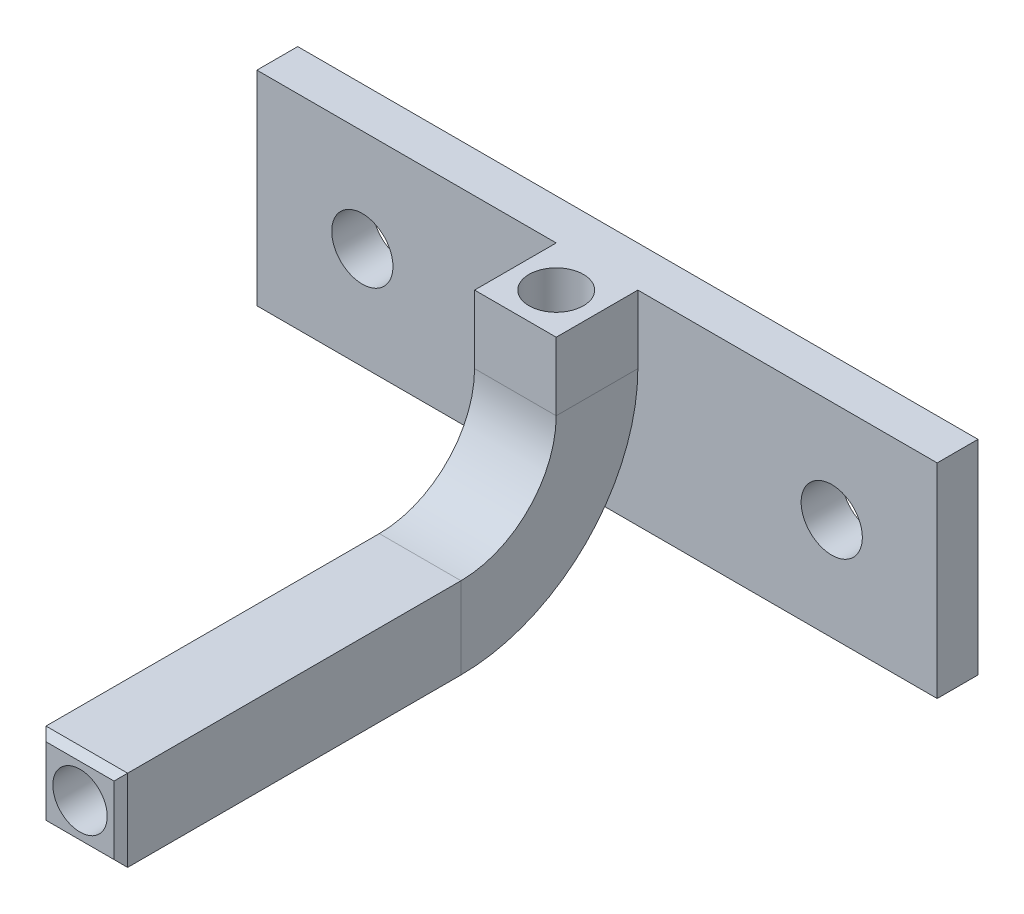
ISO-10303-21;
HEADER;
FILE_DESCRIPTION(('STEP AP214'),'2;1');
FILE_NAME('part.step','',(''),(''),'','','');
FILE_SCHEMA(('AUTOMOTIVE_DESIGN { 1 0 10303 214 1 1 1 1 }'));
ENDSEC;
DATA;
#1=APPLICATION_CONTEXT('core data for automotive mechanical design processes');
#2=APPLICATION_PROTOCOL_DEFINITION('international standard','automotive_design',2000,#1);
#3=PRODUCT_CONTEXT('',#1,'mechanical');
#4=PRODUCT('Part','Part','',(#3));
#5=PRODUCT_RELATED_PRODUCT_CATEGORY('part','',(#4));
#6=PRODUCT_DEFINITION_FORMATION('','',#4);
#7=PRODUCT_DEFINITION_CONTEXT('part definition',#1,'design');
#8=PRODUCT_DEFINITION('design','',#6,#7);
#9=PRODUCT_DEFINITION_SHAPE('','',#8);
#10=(LENGTH_UNIT() NAMED_UNIT(*) SI_UNIT(.MILLI.,.METRE.));
#11=(NAMED_UNIT(*) PLANE_ANGLE_UNIT() SI_UNIT($,.RADIAN.));
#12=(NAMED_UNIT(*) SI_UNIT($,.STERADIAN.) SOLID_ANGLE_UNIT());
#13=UNCERTAINTY_MEASURE_WITH_UNIT(LENGTH_MEASURE(1.E-05),#10,'distance_accuracy_value','');
#14=(GEOMETRIC_REPRESENTATION_CONTEXT(3) GLOBAL_UNCERTAINTY_ASSIGNED_CONTEXT((#13)) GLOBAL_UNIT_ASSIGNED_CONTEXT((#10,
#11,#12)) REPRESENTATION_CONTEXT('',''));
#15=CARTESIAN_POINT('',(0.,0.,0.));
#16=DIRECTION('',(0.,0.,1.));
#17=DIRECTION('',(1.,0.,0.));
#18=AXIS2_PLACEMENT_3D('',#15,#16,#17);
#19=CARTESIAN_POINT('',(0.,0.,3.));
#20=DIRECTION('',(0.,0.,-1.));
#21=DIRECTION('',(-1.,0.,0.));
#22=AXIS2_PLACEMENT_3D('',#19,#20,#21);
#23=PLANE('',#22);
#24=CARTESIAN_POINT('',(17.25,0.,3.));
#25=DIRECTION('',(0.,0.,1.));
#26=DIRECTION('',(1.,0.,0.));
#27=AXIS2_PLACEMENT_3D('',#24,#25,#26);
#28=CIRCLE('',#27,2.25);
#29=CARTESIAN_POINT('',(19.5,0.,3.));
#30=VERTEX_POINT('',#29);
#31=EDGE_CURVE('E278',#30,#30,#28,.T.);
#32=ORIENTED_EDGE('',*,*,#31,.F.);
#33=EDGE_LOOP('',(#32));
#34=FACE_BOUND('',#33,.T.);
#35=CARTESIAN_POINT('',(-17.25,0.,3.));
#36=DIRECTION('',(0.,0.,1.));
#37=DIRECTION('',(1.,0.,0.));
#38=AXIS2_PLACEMENT_3D('',#35,#36,#37);
#39=CIRCLE('',#38,2.25);
#40=CARTESIAN_POINT('',(-15.,0.,3.));
#41=VERTEX_POINT('',#40);
#42=EDGE_CURVE('E186',#41,#41,#39,.T.);
#43=ORIENTED_EDGE('',*,*,#42,.F.);
#44=EDGE_LOOP('',(#43));
#45=FACE_BOUND('',#44,.T.);
#46=DIRECTION('',(0.,-1.,0.));
#47=VECTOR('',#46,1.);
#48=CARTESIAN_POINT('',(-3.,7.5,3.));
#49=LINE('',#48,#47);
#50=CARTESIAN_POINT('',(-3.,7.5,3.));
#51=VERTEX_POINT('',#50);
#52=CARTESIAN_POINT('',(-3.,2.5,3.));
#53=VERTEX_POINT('',#52);
#54=EDGE_CURVE('E252',#51,#53,#49,.T.);
#55=ORIENTED_EDGE('',*,*,#54,.F.);
#56=DIRECTION('',(-1.,0.,0.));
#57=VECTOR('',#56,1.);
#58=CARTESIAN_POINT('',(-25.,7.5,3.));
#59=LINE('',#58,#57);
#60=CARTESIAN_POINT('',(-25.,7.5,3.));
#61=VERTEX_POINT('',#60);
#62=EDGE_CURVE('E173',#51,#61,#59,.T.);
#63=ORIENTED_EDGE('',*,*,#62,.T.);
#64=DIRECTION('',(0.,-1.,0.));
#65=VECTOR('',#64,1.);
#66=CARTESIAN_POINT('',(-25.,-7.5,3.));
#67=LINE('',#66,#65);
#68=CARTESIAN_POINT('',(-25.,-7.5,3.));
#69=VERTEX_POINT('',#68);
#70=EDGE_CURVE('E172',#61,#69,#67,.T.);
#71=ORIENTED_EDGE('',*,*,#70,.T.);
#72=DIRECTION('',(1.,0.,0.));
#73=VECTOR('',#72,1.);
#74=CARTESIAN_POINT('',(-25.,-7.5,3.));
#75=LINE('',#74,#73);
#76=CARTESIAN_POINT('',(25.,-7.5,3.));
#77=VERTEX_POINT('',#76);
#78=EDGE_CURVE('E175',#69,#77,#75,.T.);
#79=ORIENTED_EDGE('',*,*,#78,.T.);
#80=DIRECTION('',(0.,1.,0.));
#81=VECTOR('',#80,1.);
#82=CARTESIAN_POINT('',(25.,-7.5,3.));
#83=LINE('',#82,#81);
#84=CARTESIAN_POINT('',(25.,7.5,3.));
#85=VERTEX_POINT('',#84);
#86=EDGE_CURVE('E170',#77,#85,#83,.T.);
#87=ORIENTED_EDGE('',*,*,#86,.T.);
#88=CARTESIAN_POINT('',(3.,7.5,3.));
#89=VERTEX_POINT('',#88);
#90=EDGE_CURVE('E149',#85,#89,#59,.T.);
#91=ORIENTED_EDGE('',*,*,#90,.T.);
#92=DIRECTION('',(0.,-1.,0.));
#93=VECTOR('',#92,1.);
#94=CARTESIAN_POINT('',(3.,7.5,3.));
#95=LINE('',#94,#93);
#96=CARTESIAN_POINT('',(3.,2.5,3.));
#97=VERTEX_POINT('',#96);
#98=EDGE_CURVE('E160',#89,#97,#95,.T.);
#99=ORIENTED_EDGE('',*,*,#98,.T.);
#100=DIRECTION('',(-1.,0.,0.));
#101=VECTOR('',#100,1.);
#102=CARTESIAN_POINT('',(3.,2.5,3.));
#103=LINE('',#102,#101);
#104=EDGE_CURVE('E166',#97,#53,#103,.T.);
#105=ORIENTED_EDGE('',*,*,#104,.T.);
#106=EDGE_LOOP('',(#55,#63,#71,#79,#87,#91,#99,#105));
#107=FACE_BOUND('',#106,.T.);
#108=ADVANCED_FACE('F41',(#34,#45,#107),#23,.F.);
#109=CARTESIAN_POINT('',(0.,0.,0.));
#110=DIRECTION('',(0.,0.,-1.));
#111=DIRECTION('',(-1.,0.,0.));
#112=AXIS2_PLACEMENT_3D('',#109,#110,#111);
#113=PLANE('',#112);
#114=CARTESIAN_POINT('',(-17.25,0.,0.));
#115=DIRECTION('',(0.,0.,1.));
#116=DIRECTION('',(1.,0.,0.));
#117=AXIS2_PLACEMENT_3D('',#114,#115,#116);
#118=CIRCLE('',#117,2.25);
#119=CARTESIAN_POINT('',(-15.,0.,0.));
#120=VERTEX_POINT('',#119);
#121=EDGE_CURVE('E281',#120,#120,#118,.T.);
#122=ORIENTED_EDGE('',*,*,#121,.T.);
#123=EDGE_LOOP('',(#122));
#124=FACE_BOUND('',#123,.T.);
#125=DIRECTION('',(0.,1.,0.));
#126=VECTOR('',#125,1.);
#127=CARTESIAN_POINT('',(25.,-7.5,0.));
#128=LINE('',#127,#126);
#129=CARTESIAN_POINT('',(25.,-7.5,0.));
#130=VERTEX_POINT('',#129);
#131=CARTESIAN_POINT('',(25.,7.5,0.));
#132=VERTEX_POINT('',#131);
#133=EDGE_CURVE('E182',#130,#132,#128,.T.);
#134=ORIENTED_EDGE('',*,*,#133,.F.);
#135=DIRECTION('',(1.,0.,0.));
#136=VECTOR('',#135,1.);
#137=CARTESIAN_POINT('',(-25.,-7.5,0.));
#138=LINE('',#137,#136);
#139=CARTESIAN_POINT('',(-25.,-7.5,0.));
#140=VERTEX_POINT('',#139);
#141=EDGE_CURVE('E190',#140,#130,#138,.T.);
#142=ORIENTED_EDGE('',*,*,#141,.F.);
#143=DIRECTION('',(0.,-1.,0.));
#144=VECTOR('',#143,1.);
#145=CARTESIAN_POINT('',(-25.,-7.5,0.));
#146=LINE('',#145,#144);
#147=CARTESIAN_POINT('',(-25.,7.5,0.));
#148=VERTEX_POINT('',#147);
#149=EDGE_CURVE('E188',#148,#140,#146,.T.);
#150=ORIENTED_EDGE('',*,*,#149,.F.);
#151=DIRECTION('',(-1.,0.,0.));
#152=VECTOR('',#151,1.);
#153=CARTESIAN_POINT('',(-25.,7.5,0.));
#154=LINE('',#153,#152);
#155=EDGE_CURVE('E185',#132,#148,#154,.T.);
#156=ORIENTED_EDGE('',*,*,#155,.F.);
#157=EDGE_LOOP('',(#134,#142,#150,#156));
#158=FACE_BOUND('',#157,.T.);
#159=CARTESIAN_POINT('',(17.25,0.,0.));
#160=DIRECTION('',(0.,0.,1.));
#161=DIRECTION('',(1.,0.,0.));
#162=AXIS2_PLACEMENT_3D('',#159,#160,#161);
#163=CIRCLE('',#162,2.25);
#164=CARTESIAN_POINT('',(19.5,0.,0.));
#165=VERTEX_POINT('',#164);
#166=EDGE_CURVE('E282',#165,#165,#163,.T.);
#167=ORIENTED_EDGE('',*,*,#166,.T.);
#168=EDGE_LOOP('',(#167));
#169=FACE_BOUND('',#168,.T.);
#170=ADVANCED_FACE('F290',(#124,#158,#169),#113,.T.);
#171=CARTESIAN_POINT('',(25.,-7.5,3.));
#172=DIRECTION('',(-1.,0.,0.));
#173=DIRECTION('',(0.,0.,1.));
#174=AXIS2_PLACEMENT_3D('',#171,#172,#173);
#175=PLANE('',#174);
#176=ORIENTED_EDGE('',*,*,#133,.T.);
#177=DIRECTION('',(0.,0.,-1.));
#178=VECTOR('',#177,1.);
#179=CARTESIAN_POINT('',(25.,7.5,3.));
#180=LINE('',#179,#178);
#181=EDGE_CURVE('E200',#85,#132,#180,.T.);
#182=ORIENTED_EDGE('',*,*,#181,.F.);
#183=ORIENTED_EDGE('',*,*,#86,.F.);
#184=DIRECTION('',(0.,0.,-1.));
#185=VECTOR('',#184,1.);
#186=CARTESIAN_POINT('',(25.,-7.5,3.));
#187=LINE('',#186,#185);
#188=EDGE_CURVE('E181',#77,#130,#187,.T.);
#189=ORIENTED_EDGE('',*,*,#188,.T.);
#190=EDGE_LOOP('',(#176,#182,#183,#189));
#191=FACE_BOUND('',#190,.T.);
#192=ADVANCED_FACE('F315',(#191),#175,.F.);
#193=CARTESIAN_POINT('',(-25.,7.5,3.));
#194=DIRECTION('',(0.,-1.,0.));
#195=DIRECTION('',(0.,0.,-1.));
#196=AXIS2_PLACEMENT_3D('',#193,#194,#195);
#197=PLANE('',#196);
#198=ORIENTED_EDGE('',*,*,#155,.T.);
#199=DIRECTION('',(0.,0.,-1.));
#200=VECTOR('',#199,1.);
#201=CARTESIAN_POINT('',(-25.,7.5,3.));
#202=LINE('',#201,#200);
#203=EDGE_CURVE('E197',#61,#148,#202,.T.);
#204=ORIENTED_EDGE('',*,*,#203,.F.);
#205=ORIENTED_EDGE('',*,*,#62,.F.);
#206=DIRECTION('',(0.,0.,1.));
#207=VECTOR('',#206,1.);
#208=CARTESIAN_POINT('',(-3.,7.5,9.));
#209=LINE('',#208,#207);
#210=CARTESIAN_POINT('',(-3.,7.5,9.));
#211=VERTEX_POINT('',#210);
#212=EDGE_CURVE('E156',#51,#211,#209,.T.);
#213=ORIENTED_EDGE('',*,*,#212,.T.);
#214=DIRECTION('',(1.,0.,0.));
#215=VECTOR('',#214,1.);
#216=CARTESIAN_POINT('',(3.,7.5,9.));
#217=LINE('',#216,#215);
#218=CARTESIAN_POINT('',(3.,7.5,9.));
#219=VERTEX_POINT('',#218);
#220=EDGE_CURVE('E152',#211,#219,#217,.T.);
#221=ORIENTED_EDGE('',*,*,#220,.T.);
#222=DIRECTION('',(0.,0.,-1.));
#223=VECTOR('',#222,1.);
#224=CARTESIAN_POINT('',(3.,7.5,9.));
#225=LINE('',#224,#223);
#226=EDGE_CURVE('E143',#219,#89,#225,.T.);
#227=ORIENTED_EDGE('',*,*,#226,.T.);
#228=ORIENTED_EDGE('',*,*,#90,.F.);
#229=ORIENTED_EDGE('',*,*,#181,.T.);
#230=EDGE_LOOP('',(#198,#204,#205,#213,#221,#227,#228,#229));
#231=FACE_BOUND('',#230,.T.);
#232=CARTESIAN_POINT('',(0.,7.5,6.));
#233=DIRECTION('',(0.,1.,0.));
#234=DIRECTION('',(0.,0.,1.));
#235=AXIS2_PLACEMENT_3D('',#232,#233,#234);
#236=CIRCLE('',#235,2.);
#237=CARTESIAN_POINT('',(0.,7.5,8.));
#238=VERTEX_POINT('',#237);
#239=EDGE_CURVE('E432',#238,#238,#236,.F.);
#240=ORIENTED_EDGE('',*,*,#239,.T.);
#241=EDGE_LOOP('',(#240));
#242=FACE_BOUND('',#241,.T.);
#243=ADVANCED_FACE('F145',(#231,#242),#197,.F.);
#244=CARTESIAN_POINT('',(-25.,-7.5,3.));
#245=DIRECTION('',(1.,0.,0.));
#246=DIRECTION('',(0.,0.,-1.));
#247=AXIS2_PLACEMENT_3D('',#244,#245,#246);
#248=PLANE('',#247);
#249=ORIENTED_EDGE('',*,*,#149,.T.);
#250=DIRECTION('',(0.,0.,-1.));
#251=VECTOR('',#250,1.);
#252=CARTESIAN_POINT('',(-25.,-7.5,3.));
#253=LINE('',#252,#251);
#254=EDGE_CURVE('E194',#69,#140,#253,.T.);
#255=ORIENTED_EDGE('',*,*,#254,.F.);
#256=ORIENTED_EDGE('',*,*,#70,.F.);
#257=ORIENTED_EDGE('',*,*,#203,.T.);
#258=EDGE_LOOP('',(#249,#255,#256,#257));
#259=FACE_BOUND('',#258,.T.);
#260=ADVANCED_FACE('F306',(#259),#248,.F.);
#261=CARTESIAN_POINT('',(-25.,-7.5,3.));
#262=DIRECTION('',(0.,1.,0.));
#263=DIRECTION('',(0.,0.,1.));
#264=AXIS2_PLACEMENT_3D('',#261,#262,#263);
#265=PLANE('',#264);
#266=ORIENTED_EDGE('',*,*,#141,.T.);
#267=ORIENTED_EDGE('',*,*,#188,.F.);
#268=ORIENTED_EDGE('',*,*,#78,.F.);
#269=ORIENTED_EDGE('',*,*,#254,.T.);
#270=EDGE_LOOP('',(#266,#267,#268,#269));
#271=FACE_BOUND('',#270,.T.);
#272=ADVANCED_FACE('F296',(#271),#265,.F.);
#273=CARTESIAN_POINT('',(-17.25,0.,3.));
#274=DIRECTION('',(0.,0.,-1.));
#275=DIRECTION('',(-1.,0.,0.));
#276=AXIS2_PLACEMENT_3D('',#273,#274,#275);
#277=CYLINDRICAL_SURFACE('',#276,2.25);
#278=ORIENTED_EDGE('',*,*,#42,.T.);
#279=EDGE_LOOP('',(#278));
#280=FACE_BOUND('',#279,.T.);
#281=ORIENTED_EDGE('',*,*,#121,.F.);
#282=EDGE_LOOP('',(#281));
#283=FACE_BOUND('',#282,.T.);
#284=ADVANCED_FACE('F293',(#280,#283),#277,.F.);
#285=CARTESIAN_POINT('',(17.25,0.,3.));
#286=DIRECTION('',(0.,0.,-1.));
#287=DIRECTION('',(-1.,0.,0.));
#288=AXIS2_PLACEMENT_3D('',#285,#286,#287);
#289=CYLINDRICAL_SURFACE('',#288,2.25);
#290=ORIENTED_EDGE('',*,*,#31,.T.);
#291=EDGE_LOOP('',(#290));
#292=FACE_BOUND('',#291,.T.);
#293=ORIENTED_EDGE('',*,*,#166,.F.);
#294=EDGE_LOOP('',(#293));
#295=FACE_BOUND('',#294,.T.);
#296=ADVANCED_FACE('F295',(#292,#295),#289,.F.);
#297=CARTESIAN_POINT('',(3.,7.5,9.));
#298=DIRECTION('',(-1.,0.,0.));
#299=DIRECTION('',(0.,0.,1.));
#300=AXIS2_PLACEMENT_3D('',#297,#298,#299);
#301=PLANE('',#300);
#302=ORIENTED_EDGE('',*,*,#98,.F.);
#303=ORIENTED_EDGE('',*,*,#226,.F.);
#304=DIRECTION('',(0.,-1.,0.));
#305=VECTOR('',#304,1.);
#306=CARTESIAN_POINT('',(3.,7.5,9.));
#307=LINE('',#306,#305);
#308=CARTESIAN_POINT('',(3.,2.5,9.));
#309=VERTEX_POINT('',#308);
#310=EDGE_CURVE('E225',#219,#309,#307,.T.);
#311=ORIENTED_EDGE('',*,*,#310,.T.);
#312=DIRECTION('',(0.,0.,-1.));
#313=VECTOR('',#312,1.);
#314=CARTESIAN_POINT('',(3.,2.5,9.));
#315=LINE('',#314,#313);
#316=EDGE_CURVE('E163',#309,#97,#315,.T.);
#317=ORIENTED_EDGE('',*,*,#316,.T.);
#318=EDGE_LOOP('',(#302,#303,#311,#317));
#319=FACE_BOUND('',#318,.T.);
#320=ADVANCED_FACE('F161',(#319),#301,.F.);
#321=CARTESIAN_POINT('',(-3.,7.5,9.));
#322=DIRECTION('',(1.,0.,0.));
#323=DIRECTION('',(0.,0.,-1.));
#324=AXIS2_PLACEMENT_3D('',#321,#322,#323);
#325=PLANE('',#324);
#326=DIRECTION('',(0.,-1.,0.));
#327=VECTOR('',#326,1.);
#328=CARTESIAN_POINT('',(-3.,7.5,9.));
#329=LINE('',#328,#327);
#330=CARTESIAN_POINT('',(-3.,2.5,9.));
#331=VERTEX_POINT('',#330);
#332=EDGE_CURVE('E265',#211,#331,#329,.T.);
#333=ORIENTED_EDGE('',*,*,#332,.F.);
#334=ORIENTED_EDGE('',*,*,#212,.F.);
#335=ORIENTED_EDGE('',*,*,#54,.T.);
#336=DIRECTION('',(0.,0.,1.));
#337=VECTOR('',#336,1.);
#338=CARTESIAN_POINT('',(-3.,2.5,9.));
#339=LINE('',#338,#337);
#340=EDGE_CURVE('E254',#53,#331,#339,.T.);
#341=ORIENTED_EDGE('',*,*,#340,.T.);
#342=EDGE_LOOP('',(#333,#334,#335,#341));
#343=FACE_BOUND('',#342,.T.);
#344=ADVANCED_FACE('F356',(#343),#325,.F.);
#345=CARTESIAN_POINT('',(3.,7.5,9.));
#346=DIRECTION('',(0.,0.,-1.));
#347=DIRECTION('',(-1.,0.,0.));
#348=AXIS2_PLACEMENT_3D('',#345,#346,#347);
#349=PLANE('',#348);
#350=DIRECTION('',(1.,0.,0.));
#351=VECTOR('',#350,1.);
#352=CARTESIAN_POINT('',(3.,2.5,9.));
#353=LINE('',#352,#351);
#354=EDGE_CURVE('E243',#331,#309,#353,.T.);
#355=ORIENTED_EDGE('',*,*,#354,.T.);
#356=ORIENTED_EDGE('',*,*,#310,.F.);
#357=ORIENTED_EDGE('',*,*,#220,.F.);
#358=ORIENTED_EDGE('',*,*,#332,.T.);
#359=EDGE_LOOP('',(#355,#356,#357,#358));
#360=FACE_BOUND('',#359,.T.);
#361=ADVANCED_FACE('F361',(#360),#349,.F.);
#362=CARTESIAN_POINT('',(3.,2.5,9.));
#363=DIRECTION('',(-1.,0.,0.));
#364=DIRECTION('',(0.,0.,1.));
#365=AXIS2_PLACEMENT_3D('',#362,#363,#364);
#366=PLANE('',#365);
#367=CARTESIAN_POINT('',(3.,2.5,16.));
#368=DIRECTION('',(-1.,0.,0.));
#369=DIRECTION('',(0.,0.,-1.));
#370=AXIS2_PLACEMENT_3D('',#367,#368,#369);
#371=CIRCLE('',#370,13.);
#372=CARTESIAN_POINT('',(3.,-10.5,16.));
#373=VERTEX_POINT('',#372);
#374=EDGE_CURVE('E236',#97,#373,#371,.T.);
#375=ORIENTED_EDGE('',*,*,#374,.F.);
#376=ORIENTED_EDGE('',*,*,#316,.F.);
#377=CARTESIAN_POINT('',(3.,2.5,16.));
#378=DIRECTION('',(-1.,0.,0.));
#379=DIRECTION('',(0.,0.,-1.));
#380=AXIS2_PLACEMENT_3D('',#377,#378,#379);
#381=CIRCLE('',#380,7.);
#382=CARTESIAN_POINT('',(3.,-4.5,16.));
#383=VERTEX_POINT('',#382);
#384=EDGE_CURVE('E237',#309,#383,#381,.T.);
#385=ORIENTED_EDGE('',*,*,#384,.T.);
#386=DIRECTION('',(0.,-1.,0.));
#387=VECTOR('',#386,1.);
#388=CARTESIAN_POINT('',(3.,-4.5,16.));
#389=LINE('',#388,#387);
#390=EDGE_CURVE('E233',#383,#373,#389,.T.);
#391=ORIENTED_EDGE('',*,*,#390,.T.);
#392=EDGE_LOOP('',(#375,#376,#385,#391));
#393=FACE_BOUND('',#392,.T.);
#394=ADVANCED_FACE('F367',(#393),#366,.F.);
#395=CARTESIAN_POINT('',(0.,2.5,16.));
#396=DIRECTION('',(-1.,0.,0.));
#397=DIRECTION('',(0.,0.,1.));
#398=AXIS2_PLACEMENT_3D('',#395,#396,#397);
#399=CYLINDRICAL_SURFACE('',#398,13.);
#400=CARTESIAN_POINT('',(-3.,2.5,16.));
#401=DIRECTION('',(-1.,0.,0.));
#402=DIRECTION('',(0.,0.,-1.));
#403=AXIS2_PLACEMENT_3D('',#400,#401,#402);
#404=CIRCLE('',#403,13.);
#405=CARTESIAN_POINT('',(-3.,-10.5,16.));
#406=VERTEX_POINT('',#405);
#407=EDGE_CURVE('E257',#53,#406,#404,.T.);
#408=ORIENTED_EDGE('',*,*,#407,.F.);
#409=ORIENTED_EDGE('',*,*,#104,.F.);
#410=ORIENTED_EDGE('',*,*,#374,.T.);
#411=DIRECTION('',(-1.,0.,0.));
#412=VECTOR('',#411,1.);
#413=CARTESIAN_POINT('',(3.,-10.5,16.));
#414=LINE('',#413,#412);
#415=EDGE_CURVE('E240',#373,#406,#414,.T.);
#416=ORIENTED_EDGE('',*,*,#415,.T.);
#417=EDGE_LOOP('',(#408,#409,#410,#416));
#418=FACE_BOUND('',#417,.T.);
#419=ADVANCED_FACE('F370',(#418),#399,.T.);
#420=CARTESIAN_POINT('',(-3.,2.5,9.));
#421=DIRECTION('',(1.,0.,0.));
#422=DIRECTION('',(0.,0.,-1.));
#423=AXIS2_PLACEMENT_3D('',#420,#421,#422);
#424=PLANE('',#423);
#425=CARTESIAN_POINT('',(-3.,2.5,16.));
#426=DIRECTION('',(-1.,0.,0.));
#427=DIRECTION('',(0.,0.,-1.));
#428=AXIS2_PLACEMENT_3D('',#425,#426,#427);
#429=CIRCLE('',#428,7.);
#430=CARTESIAN_POINT('',(-3.,-4.5,16.));
#431=VERTEX_POINT('',#430);
#432=EDGE_CURVE('E270',#331,#431,#429,.T.);
#433=ORIENTED_EDGE('',*,*,#432,.F.);
#434=ORIENTED_EDGE('',*,*,#340,.F.);
#435=ORIENTED_EDGE('',*,*,#407,.T.);
#436=DIRECTION('',(0.,1.,0.));
#437=VECTOR('',#436,1.);
#438=CARTESIAN_POINT('',(-3.,-4.5,16.));
#439=LINE('',#438,#437);
#440=EDGE_CURVE('E260',#406,#431,#439,.T.);
#441=ORIENTED_EDGE('',*,*,#440,.T.);
#442=EDGE_LOOP('',(#433,#434,#435,#441));
#443=FACE_BOUND('',#442,.T.);
#444=ADVANCED_FACE('F380',(#443),#424,.F.);
#445=CARTESIAN_POINT('',(0.,2.5,16.));
#446=DIRECTION('',(-1.,0.,0.));
#447=DIRECTION('',(0.,0.,1.));
#448=AXIS2_PLACEMENT_3D('',#445,#446,#447);
#449=CYLINDRICAL_SURFACE('',#448,7.);
#450=DIRECTION('',(1.,0.,0.));
#451=VECTOR('',#450,1.);
#452=CARTESIAN_POINT('',(3.,-4.5,16.));
#453=LINE('',#452,#451);
#454=EDGE_CURVE('E250',#431,#383,#453,.T.);
#455=ORIENTED_EDGE('',*,*,#454,.T.);
#456=ORIENTED_EDGE('',*,*,#384,.F.);
#457=ORIENTED_EDGE('',*,*,#354,.F.);
#458=ORIENTED_EDGE('',*,*,#432,.T.);
#459=EDGE_LOOP('',(#455,#456,#457,#458));
#460=FACE_BOUND('',#459,.T.);
#461=ADVANCED_FACE('F376',(#460),#449,.F.);
#462=CARTESIAN_POINT('',(3.,-4.5,16.));
#463=DIRECTION('',(-1.,0.,0.));
#464=DIRECTION('',(0.,0.,1.));
#465=AXIS2_PLACEMENT_3D('',#462,#463,#464);
#466=PLANE('',#465);
#467=DIRECTION('',(0.,0.,1.));
#468=VECTOR('',#467,1.);
#469=CARTESIAN_POINT('',(3.,-4.5,16.));
#470=LINE('',#469,#468);
#471=CARTESIAN_POINT('',(3.,-4.5,40.5));
#472=VERTEX_POINT('',#471);
#473=EDGE_CURVE('E247',#383,#472,#470,.T.);
#474=ORIENTED_EDGE('',*,*,#473,.T.);
#475=DIRECTION('',(0.,-1.,0.));
#476=VECTOR('',#475,1.);
#477=CARTESIAN_POINT('',(3.,-4.5,40.5));
#478=LINE('',#477,#476);
#479=CARTESIAN_POINT('',(3.,-10.5,40.5));
#480=VERTEX_POINT('',#479);
#481=EDGE_CURVE('E202',#472,#480,#478,.T.);
#482=ORIENTED_EDGE('',*,*,#481,.T.);
#483=DIRECTION('',(0.,0.,1.));
#484=VECTOR('',#483,1.);
#485=CARTESIAN_POINT('',(3.,-10.5,16.));
#486=LINE('',#485,#484);
#487=EDGE_CURVE('E244',#373,#480,#486,.T.);
#488=ORIENTED_EDGE('',*,*,#487,.F.);
#489=ORIENTED_EDGE('',*,*,#390,.F.);
#490=EDGE_LOOP('',(#474,#482,#488,#489));
#491=FACE_BOUND('',#490,.T.);
#492=ADVANCED_FACE('F372',(#491),#466,.F.);
#493=CARTESIAN_POINT('',(3.,-10.5,16.));
#494=DIRECTION('',(0.,1.,0.));
#495=DIRECTION('',(0.,0.,1.));
#496=AXIS2_PLACEMENT_3D('',#493,#494,#495);
#497=PLANE('',#496);
#498=ORIENTED_EDGE('',*,*,#487,.T.);
#499=DIRECTION('',(-1.,0.,0.));
#500=VECTOR('',#499,1.);
#501=CARTESIAN_POINT('',(3.,-10.5,40.5));
#502=LINE('',#501,#500);
#503=CARTESIAN_POINT('',(-3.,-10.5,40.5));
#504=VERTEX_POINT('',#503);
#505=EDGE_CURVE('E66',#480,#504,#502,.T.);
#506=ORIENTED_EDGE('',*,*,#505,.T.);
#507=DIRECTION('',(0.,0.,1.));
#508=VECTOR('',#507,1.);
#509=CARTESIAN_POINT('',(-3.,-10.5,16.));
#510=LINE('',#509,#508);
#511=EDGE_CURVE('E246',#406,#504,#510,.T.);
#512=ORIENTED_EDGE('',*,*,#511,.F.);
#513=ORIENTED_EDGE('',*,*,#415,.F.);
#514=EDGE_LOOP('',(#498,#506,#512,#513));
#515=FACE_BOUND('',#514,.T.);
#516=ADVANCED_FACE('F375',(#515),#497,.F.);
#517=CARTESIAN_POINT('',(-3.,-4.5,16.));
#518=DIRECTION('',(1.,0.,0.));
#519=DIRECTION('',(0.,0.,-1.));
#520=AXIS2_PLACEMENT_3D('',#517,#518,#519);
#521=PLANE('',#520);
#522=ORIENTED_EDGE('',*,*,#511,.T.);
#523=DIRECTION('',(0.,1.,0.));
#524=VECTOR('',#523,1.);
#525=CARTESIAN_POINT('',(-3.,-4.5,40.5));
#526=LINE('',#525,#524);
#527=CARTESIAN_POINT('',(-3.,-4.5,40.5));
#528=VERTEX_POINT('',#527);
#529=EDGE_CURVE('E51',#504,#528,#526,.T.);
#530=ORIENTED_EDGE('',*,*,#529,.T.);
#531=DIRECTION('',(0.,0.,1.));
#532=VECTOR('',#531,1.);
#533=CARTESIAN_POINT('',(-3.,-4.5,16.));
#534=LINE('',#533,#532);
#535=EDGE_CURVE('E262',#431,#528,#534,.T.);
#536=ORIENTED_EDGE('',*,*,#535,.F.);
#537=ORIENTED_EDGE('',*,*,#440,.F.);
#538=EDGE_LOOP('',(#522,#530,#536,#537));
#539=FACE_BOUND('',#538,.T.);
#540=ADVANCED_FACE('F383',(#539),#521,.F.);
#541=CARTESIAN_POINT('',(3.,-4.5,16.));
#542=DIRECTION('',(0.,-1.,0.));
#543=DIRECTION('',(0.,0.,-1.));
#544=AXIS2_PLACEMENT_3D('',#541,#542,#543);
#545=PLANE('',#544);
#546=ORIENTED_EDGE('',*,*,#535,.T.);
#547=DIRECTION('',(1.,0.,0.));
#548=VECTOR('',#547,1.);
#549=CARTESIAN_POINT('',(3.,-4.5,40.5));
#550=LINE('',#549,#548);
#551=EDGE_CURVE('E11',#528,#472,#550,.T.);
#552=ORIENTED_EDGE('',*,*,#551,.T.);
#553=ORIENTED_EDGE('',*,*,#473,.F.);
#554=ORIENTED_EDGE('',*,*,#454,.F.);
#555=EDGE_LOOP('',(#546,#552,#553,#554));
#556=FACE_BOUND('',#555,.T.);
#557=ADVANCED_FACE('F390',(#556),#545,.F.);
#558=CARTESIAN_POINT('',(0.,-13.5,41.));
#559=DIRECTION('',(0.,0.,-1.));
#560=DIRECTION('',(0.,1.,0.));
#561=AXIS2_PLACEMENT_3D('',#558,#559,#560);
#562=PLANE('',#561);
#563=DIRECTION('',(1.,0.,0.));
#564=VECTOR('',#563,1.);
#565=CARTESIAN_POINT('',(0.,-10.,41.));
#566=LINE('',#565,#564);
#567=CARTESIAN_POINT('',(-2.5,-10.,41.));
#568=VERTEX_POINT('',#567);
#569=CARTESIAN_POINT('',(2.5,-10.,41.));
#570=VERTEX_POINT('',#569);
#571=EDGE_CURVE('E209',#568,#570,#566,.T.);
#572=ORIENTED_EDGE('',*,*,#571,.T.);
#573=DIRECTION('',(0.,1.,0.));
#574=VECTOR('',#573,1.);
#575=CARTESIAN_POINT('',(2.5,-13.5,41.));
#576=LINE('',#575,#574);
#577=CARTESIAN_POINT('',(2.5,-5.,41.));
#578=VERTEX_POINT('',#577);
#579=EDGE_CURVE('E211',#570,#578,#576,.T.);
#580=ORIENTED_EDGE('',*,*,#579,.T.);
#581=DIRECTION('',(-1.,0.,0.));
#582=VECTOR('',#581,1.);
#583=CARTESIAN_POINT('',(0.,-5.,41.));
#584=LINE('',#583,#582);
#585=CARTESIAN_POINT('',(-2.5,-5.,41.));
#586=VERTEX_POINT('',#585);
#587=EDGE_CURVE('E205',#578,#586,#584,.T.);
#588=ORIENTED_EDGE('',*,*,#587,.T.);
#589=DIRECTION('',(0.,-1.,0.));
#590=VECTOR('',#589,1.);
#591=CARTESIAN_POINT('',(-2.5,-13.5,41.));
#592=LINE('',#591,#590);
#593=EDGE_CURVE('E207',#586,#568,#592,.T.);
#594=ORIENTED_EDGE('',*,*,#593,.T.);
#595=EDGE_LOOP('',(#572,#580,#588,#594));
#596=FACE_BOUND('',#595,.T.);
#597=CARTESIAN_POINT('',(0.,-7.5,41.));
#598=DIRECTION('',(0.,0.,-1.));
#599=DIRECTION('',(0.,1.,0.));
#600=AXIS2_PLACEMENT_3D('',#597,#598,#599);
#601=CIRCLE('',#600,2.);
#602=CARTESIAN_POINT('',(0.,-5.5,41.));
#603=VERTEX_POINT('',#602);
#604=EDGE_CURVE('E285',#603,#603,#601,.F.);
#605=ORIENTED_EDGE('',*,*,#604,.F.);
#606=EDGE_LOOP('',(#605));
#607=FACE_BOUND('',#606,.T.);
#608=ADVANCED_FACE('F366',(#596,#607),#562,.F.);
#609=CARTESIAN_POINT('',(0.,7.5,6.));
#610=DIRECTION('',(0.,-1.,0.));
#611=DIRECTION('',(0.,0.,-1.));
#612=AXIS2_PLACEMENT_3D('',#609,#610,#611);
#613=CYLINDRICAL_SURFACE('',#612,2.);
#614=CARTESIAN_POINT('',(0.,2.5,6.));
#615=DIRECTION('',(0.,1.,0.));
#616=DIRECTION('',(0.,0.,1.));
#617=AXIS2_PLACEMENT_3D('',#614,#615,#616);
#618=CIRCLE('',#617,2.);
#619=CARTESIAN_POINT('',(0.,2.5,4.));
#620=VERTEX_POINT('',#619);
#621=EDGE_CURVE('E439',#620,#620,#618,.F.);
#622=ORIENTED_EDGE('',*,*,#621,.T.);
#623=EDGE_LOOP('',(#622));
#624=FACE_BOUND('',#623,.T.);
#625=ORIENTED_EDGE('',*,*,#239,.F.);
#626=EDGE_LOOP('',(#625));
#627=FACE_BOUND('',#626,.T.);
#628=ADVANCED_FACE('F402',(#624,#627),#613,.F.);
#629=CARTESIAN_POINT('',(0.,2.5,16.));
#630=DIRECTION('',(-1.,0.,0.));
#631=DIRECTION('',(0.,0.,1.));
#632=AXIS2_PLACEMENT_3D('',#629,#630,#631);
#633=TOROIDAL_SURFACE('',#632,10.,2.);
#634=CARTESIAN_POINT('',(0.,-7.5,16.));
#635=DIRECTION('',(0.,0.,-1.));
#636=DIRECTION('',(0.,1.,0.));
#637=AXIS2_PLACEMENT_3D('',#634,#635,#636);
#638=CIRCLE('',#637,2.);
#639=CARTESIAN_POINT('',(0.,-9.5,16.));
#640=VERTEX_POINT('',#639);
#641=EDGE_CURVE('E436',#640,#640,#638,.F.);
#642=CARTESIAN_POINT('',(0.,2.5,16.));
#643=DIRECTION('',(-1.,0.,0.));
#644=DIRECTION('',(0.,0.,1.));
#645=AXIS2_PLACEMENT_3D('',#642,#643,#644);
#646=CIRCLE('',#645,12.);
#647=EDGE_CURVE('',#620,#640,#646,.T.);
#648=ORIENTED_EDGE('',*,*,#621,.F.);
#649=ORIENTED_EDGE('',*,*,#641,.T.);
#650=ORIENTED_EDGE('',*,*,#647,.T.);
#651=ORIENTED_EDGE('',*,*,#647,.F.);
#652=EDGE_LOOP('',(#648,#650,#649,#651));
#653=FACE_BOUND('',#652,.T.);
#654=ADVANCED_FACE('F352',(#653),#633,.F.);
#655=CARTESIAN_POINT('',(0.,-7.5,16.));
#656=DIRECTION('',(0.,0.,1.));
#657=DIRECTION('',(1.,0.,0.));
#658=AXIS2_PLACEMENT_3D('',#655,#656,#657);
#659=CYLINDRICAL_SURFACE('',#658,2.);
#660=ORIENTED_EDGE('',*,*,#604,.T.);
#661=EDGE_LOOP('',(#660));
#662=FACE_BOUND('',#661,.T.);
#663=ORIENTED_EDGE('',*,*,#641,.F.);
#664=EDGE_LOOP('',(#663));
#665=FACE_BOUND('',#664,.T.);
#666=ADVANCED_FACE('F305',(#662,#665),#659,.F.);
#667=CARTESIAN_POINT('',(-3.,-4.5,40.5));
#668=DIRECTION('',(0.707106781186547,0.,-0.707106781186547));
#669=DIRECTION('',(0.,1.,0.));
#670=AXIS2_PLACEMENT_3D('',#667,#668,#669);
#671=PLANE('',#670);
#672=DIRECTION('',(0.577350269189626,0.577350269189626,0.577350269189626));
#673=VECTOR('',#672,1.);
#674=CARTESIAN_POINT('',(-1.,-8.5,42.5));
#675=LINE('',#674,#673);
#676=EDGE_CURVE('E219',#568,#504,#675,.F.);
#677=ORIENTED_EDGE('',*,*,#676,.F.);
#678=ORIENTED_EDGE('',*,*,#593,.F.);
#679=DIRECTION('',(0.577350269189626,-0.577350269189626,0.577350269189626));
#680=VECTOR('',#679,1.);
#681=CARTESIAN_POINT('',(-1.,-6.5,42.5));
#682=LINE('',#681,#680);
#683=EDGE_CURVE('E46',#528,#586,#682,.T.);
#684=ORIENTED_EDGE('',*,*,#683,.F.);
#685=ORIENTED_EDGE('',*,*,#529,.F.);
#686=EDGE_LOOP('',(#677,#678,#684,#685));
#687=FACE_BOUND('',#686,.T.);
#688=ADVANCED_FACE('F44',(#687),#671,.F.);
#689=CARTESIAN_POINT('',(3.,-4.5,40.5));
#690=DIRECTION('',(0.,-0.707106781186547,-0.707106781186547));
#691=DIRECTION('',(1.,0.,0.));
#692=AXIS2_PLACEMENT_3D('',#689,#690,#691);
#693=PLANE('',#692);
#694=ORIENTED_EDGE('',*,*,#683,.T.);
#695=ORIENTED_EDGE('',*,*,#587,.F.);
#696=DIRECTION('',(0.577350269189626,0.577350269189626,-0.577350269189626));
#697=VECTOR('',#696,1.);
#698=CARTESIAN_POINT('',(3.,-4.5,40.5));
#699=LINE('',#698,#697);
#700=EDGE_CURVE('E218',#472,#578,#699,.F.);
#701=ORIENTED_EDGE('',*,*,#700,.F.);
#702=ORIENTED_EDGE('',*,*,#551,.F.);
#703=EDGE_LOOP('',(#694,#695,#701,#702));
#704=FACE_BOUND('',#703,.T.);
#705=ADVANCED_FACE('F341',(#704),#693,.F.);
#706=CARTESIAN_POINT('',(3.,-10.5,40.5));
#707=DIRECTION('',(0.,0.707106781186547,-0.707106781186547));
#708=DIRECTION('',(-1.,0.,0.));
#709=AXIS2_PLACEMENT_3D('',#706,#707,#708);
#710=PLANE('',#709);
#711=ORIENTED_EDGE('',*,*,#676,.T.);
#712=ORIENTED_EDGE('',*,*,#505,.F.);
#713=DIRECTION('',(-0.577350269189626,0.577350269189626,0.577350269189626));
#714=VECTOR('',#713,1.);
#715=CARTESIAN_POINT('',(3.,-10.5,40.5));
#716=LINE('',#715,#714);
#717=EDGE_CURVE('E216',#570,#480,#716,.F.);
#718=ORIENTED_EDGE('',*,*,#717,.F.);
#719=ORIENTED_EDGE('',*,*,#571,.F.);
#720=EDGE_LOOP('',(#711,#712,#718,#719));
#721=FACE_BOUND('',#720,.T.);
#722=ADVANCED_FACE('F335',(#721),#710,.F.);
#723=CARTESIAN_POINT('',(3.,-4.5,40.5));
#724=DIRECTION('',(-0.707106781186547,0.,-0.707106781186547));
#725=DIRECTION('',(0.,-1.,0.));
#726=AXIS2_PLACEMENT_3D('',#723,#724,#725);
#727=PLANE('',#726);
#728=ORIENTED_EDGE('',*,*,#700,.T.);
#729=ORIENTED_EDGE('',*,*,#579,.F.);
#730=ORIENTED_EDGE('',*,*,#717,.T.);
#731=ORIENTED_EDGE('',*,*,#481,.F.);
#732=EDGE_LOOP('',(#728,#729,#730,#731));
#733=FACE_BOUND('',#732,.T.);
#734=ADVANCED_FACE('F329',(#733),#727,.F.);
#735=CLOSED_SHELL('',(#108,#170,#192,#243,#260,#272,#284,#296,#320,#344,#361,#394,#419,#444,
#461,#492,#516,#540,#557,#608,#628,#654,#666,#688,#705,#722,#734));
#736=MANIFOLD_SOLID_BREP('B2',#735);
#737=ADVANCED_BREP_SHAPE_REPRESENTATION('',(#18,#736),#14);
#738=SHAPE_DEFINITION_REPRESENTATION(#9,#737);
ENDSEC;
END-ISO-10303-21;
